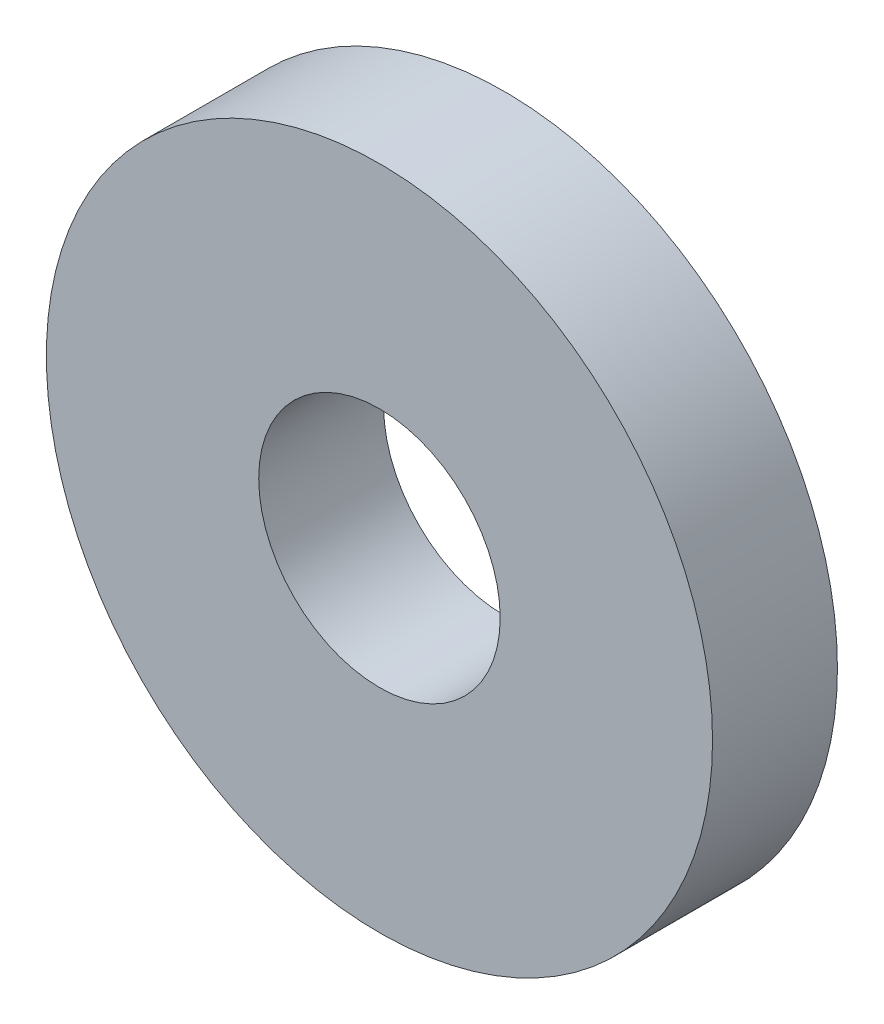
ISO-10303-21;
HEADER;
FILE_DESCRIPTION(('STEP AP214'),'2;1');
FILE_NAME('part.step','',(''),(''),'','','');
FILE_SCHEMA(('AUTOMOTIVE_DESIGN { 1 0 10303 214 1 1 1 1 }'));
ENDSEC;
DATA;
#1=APPLICATION_CONTEXT('core data for automotive mechanical design processes');
#2=APPLICATION_PROTOCOL_DEFINITION('international standard','automotive_design',2000,#1);
#3=PRODUCT_CONTEXT('',#1,'mechanical');
#4=PRODUCT('Part','Part','',(#3));
#5=PRODUCT_RELATED_PRODUCT_CATEGORY('part','',(#4));
#6=PRODUCT_DEFINITION_FORMATION('','',#4);
#7=PRODUCT_DEFINITION_CONTEXT('part definition',#1,'design');
#8=PRODUCT_DEFINITION('design','',#6,#7);
#9=PRODUCT_DEFINITION_SHAPE('','',#8);
#10=(LENGTH_UNIT() NAMED_UNIT(*) SI_UNIT(.MILLI.,.METRE.));
#11=(NAMED_UNIT(*) PLANE_ANGLE_UNIT() SI_UNIT($,.RADIAN.));
#12=(NAMED_UNIT(*) SI_UNIT($,.STERADIAN.) SOLID_ANGLE_UNIT());
#13=UNCERTAINTY_MEASURE_WITH_UNIT(LENGTH_MEASURE(1.E-05),#10,'distance_accuracy_value','');
#14=(GEOMETRIC_REPRESENTATION_CONTEXT(3) GLOBAL_UNCERTAINTY_ASSIGNED_CONTEXT((#13)) GLOBAL_UNIT_ASSIGNED_CONTEXT((#10,
#11,#12)) REPRESENTATION_CONTEXT('',''));
#15=CARTESIAN_POINT('',(0.,0.,0.));
#16=DIRECTION('',(0.,0.,1.));
#17=DIRECTION('',(1.,0.,0.));
#18=AXIS2_PLACEMENT_3D('',#15,#16,#17);
#19=CARTESIAN_POINT('',(0.,0.,1.5));
#20=DIRECTION('',(0.,0.,1.));
#21=DIRECTION('',(1.,0.,0.));
#22=AXIS2_PLACEMENT_3D('',#19,#20,#21);
#23=PLANE('',#22);
#24=CARTESIAN_POINT('',(0.,0.,1.5));
#25=DIRECTION('',(0.,0.,1.));
#26=DIRECTION('',(1.,0.,0.));
#27=AXIS2_PLACEMENT_3D('',#24,#25,#26);
#28=CIRCLE('',#27,4.);
#29=CARTESIAN_POINT('',(4.,0.,1.5));
#30=VERTEX_POINT('',#29);
#31=EDGE_CURVE('E10',#30,#30,#28,.T.);
#32=ORIENTED_EDGE('',*,*,#31,.T.);
#33=EDGE_LOOP('',(#32));
#34=FACE_BOUND('',#33,.T.);
#35=CARTESIAN_POINT('',(0.,0.,1.5));
#36=DIRECTION('',(0.,0.,1.));
#37=DIRECTION('',(1.,0.,0.));
#38=AXIS2_PLACEMENT_3D('',#35,#36,#37);
#39=CIRCLE('',#38,1.45);
#40=CARTESIAN_POINT('',(1.45,0.,1.5));
#41=VERTEX_POINT('',#40);
#42=EDGE_CURVE('E42',#41,#41,#39,.T.);
#43=ORIENTED_EDGE('',*,*,#42,.F.);
#44=EDGE_LOOP('',(#43));
#45=FACE_BOUND('',#44,.T.);
#46=ADVANCED_FACE('F31',(#34,#45),#23,.T.);
#47=CARTESIAN_POINT('',(0.,0.,0.));
#48=DIRECTION('',(0.,0.,1.));
#49=DIRECTION('',(1.,0.,0.));
#50=AXIS2_PLACEMENT_3D('',#47,#48,#49);
#51=PLANE('',#50);
#52=CARTESIAN_POINT('',(0.,0.,0.));
#53=DIRECTION('',(0.,0.,1.));
#54=DIRECTION('',(1.,0.,0.));
#55=AXIS2_PLACEMENT_3D('',#52,#53,#54);
#56=CIRCLE('',#55,4.);
#57=CARTESIAN_POINT('',(4.,0.,0.));
#58=VERTEX_POINT('',#57);
#59=EDGE_CURVE('E35',#58,#58,#56,.T.);
#60=ORIENTED_EDGE('',*,*,#59,.F.);
#61=EDGE_LOOP('',(#60));
#62=FACE_BOUND('',#61,.T.);
#63=CARTESIAN_POINT('',(0.,0.,0.));
#64=DIRECTION('',(0.,0.,1.));
#65=DIRECTION('',(1.,0.,0.));
#66=AXIS2_PLACEMENT_3D('',#63,#64,#65);
#67=CIRCLE('',#66,1.45);
#68=CARTESIAN_POINT('',(1.45,0.,0.));
#69=VERTEX_POINT('',#68);
#70=EDGE_CURVE('E44',#69,#69,#67,.T.);
#71=ORIENTED_EDGE('',*,*,#70,.T.);
#72=EDGE_LOOP('',(#71));
#73=FACE_BOUND('',#72,.T.);
#74=ADVANCED_FACE('F54',(#62,#73),#51,.F.);
#75=CARTESIAN_POINT('',(0.,0.,1.5));
#76=DIRECTION('',(0.,0.,-1.));
#77=DIRECTION('',(-1.,0.,0.));
#78=AXIS2_PLACEMENT_3D('',#75,#76,#77);
#79=CYLINDRICAL_SURFACE('',#78,4.);
#80=ORIENTED_EDGE('',*,*,#31,.F.);
#81=EDGE_LOOP('',(#80));
#82=FACE_BOUND('',#81,.T.);
#83=ORIENTED_EDGE('',*,*,#59,.T.);
#84=EDGE_LOOP('',(#83));
#85=FACE_BOUND('',#84,.T.);
#86=ADVANCED_FACE('F33',(#82,#85),#79,.T.);
#87=CARTESIAN_POINT('',(0.,0.,1.5));
#88=DIRECTION('',(0.,0.,-1.));
#89=DIRECTION('',(-1.,0.,0.));
#90=AXIS2_PLACEMENT_3D('',#87,#88,#89);
#91=CYLINDRICAL_SURFACE('',#90,1.45);
#92=ORIENTED_EDGE('',*,*,#42,.T.);
#93=EDGE_LOOP('',(#92));
#94=FACE_BOUND('',#93,.T.);
#95=ORIENTED_EDGE('',*,*,#70,.F.);
#96=EDGE_LOOP('',(#95));
#97=FACE_BOUND('',#96,.T.);
#98=ADVANCED_FACE('F50',(#94,#97),#91,.F.);
#99=CLOSED_SHELL('',(#46,#74,#86,#98));
#100=MANIFOLD_SOLID_BREP('B2',#99);
#101=ADVANCED_BREP_SHAPE_REPRESENTATION('',(#18,#100),#14);
#102=SHAPE_DEFINITION_REPRESENTATION(#9,#101);
ENDSEC;
END-ISO-10303-21;
